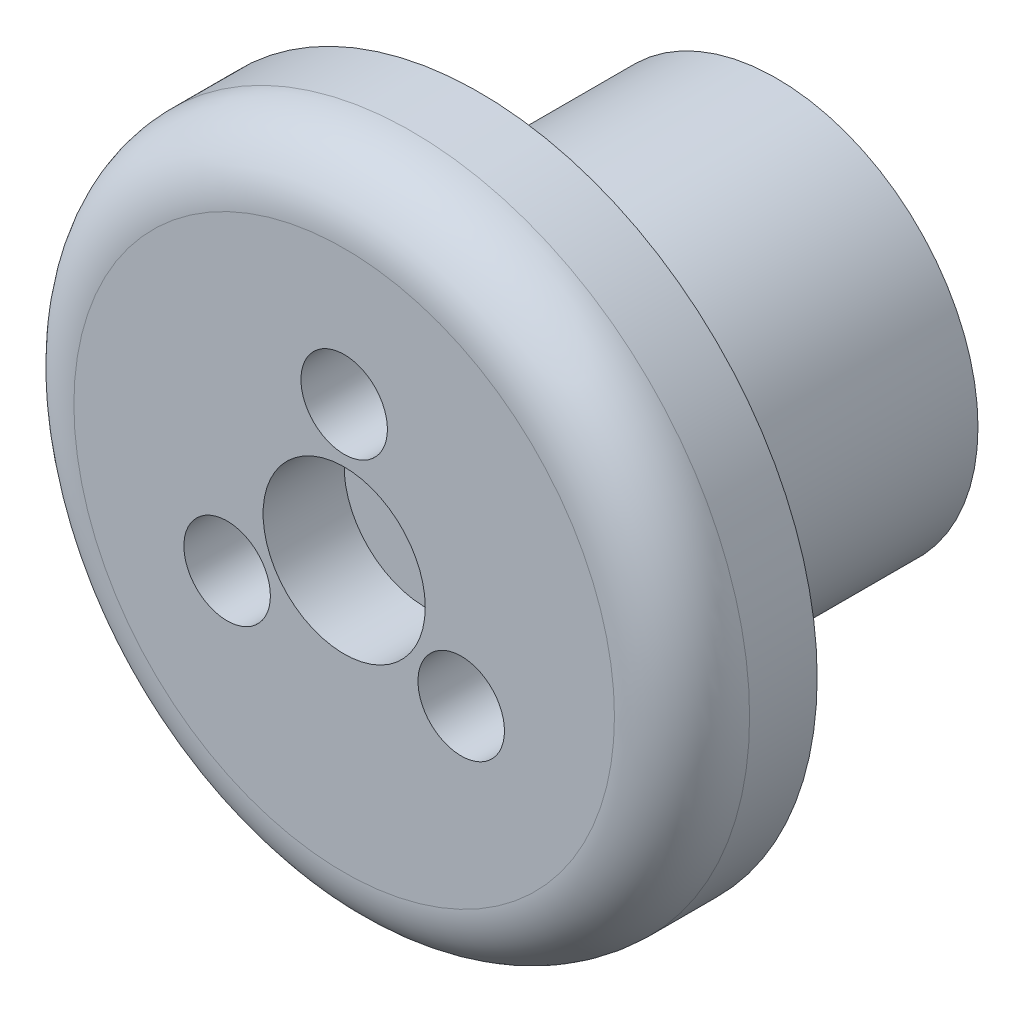
ISO-10303-21;
HEADER;
FILE_DESCRIPTION(('STEP AP214'),'2;1');
FILE_NAME('part.step','',(''),(''),'','','');
FILE_SCHEMA(('AUTOMOTIVE_DESIGN { 1 0 10303 214 1 1 1 1 }'));
ENDSEC;
DATA;
#1=APPLICATION_CONTEXT('core data for automotive mechanical design processes');
#2=APPLICATION_PROTOCOL_DEFINITION('international standard','automotive_design',2000,#1);
#3=PRODUCT_CONTEXT('',#1,'mechanical');
#4=PRODUCT('Part','Part','',(#3));
#5=PRODUCT_RELATED_PRODUCT_CATEGORY('part','',(#4));
#6=PRODUCT_DEFINITION_FORMATION('','',#4);
#7=PRODUCT_DEFINITION_CONTEXT('part definition',#1,'design');
#8=PRODUCT_DEFINITION('design','',#6,#7);
#9=PRODUCT_DEFINITION_SHAPE('','',#8);
#10=(LENGTH_UNIT() NAMED_UNIT(*) SI_UNIT(.MILLI.,.METRE.));
#11=(NAMED_UNIT(*) PLANE_ANGLE_UNIT() SI_UNIT($,.RADIAN.));
#12=(NAMED_UNIT(*) SI_UNIT($,.STERADIAN.) SOLID_ANGLE_UNIT());
#13=UNCERTAINTY_MEASURE_WITH_UNIT(LENGTH_MEASURE(1.E-05),#10,'distance_accuracy_value','');
#14=(GEOMETRIC_REPRESENTATION_CONTEXT(3) GLOBAL_UNCERTAINTY_ASSIGNED_CONTEXT((#13)) GLOBAL_UNIT_ASSIGNED_CONTEXT((#10,
#11,#12)) REPRESENTATION_CONTEXT('',''));
#15=CARTESIAN_POINT('',(0.,0.,0.));
#16=DIRECTION('',(0.,0.,1.));
#17=DIRECTION('',(1.,0.,0.));
#18=AXIS2_PLACEMENT_3D('',#15,#16,#17);
#19=CARTESIAN_POINT('',(0.,0.,11.));
#20=DIRECTION('',(0.,0.,-1.));
#21=DIRECTION('',(-1.,0.,0.));
#22=AXIS2_PLACEMENT_3D('',#19,#20,#21);
#23=CYLINDRICAL_SURFACE('',#22,7.45);
#24=CARTESIAN_POINT('',(0.,0.,11.));
#25=DIRECTION('',(0.,0.,1.));
#26=DIRECTION('',(1.,0.,0.));
#27=AXIS2_PLACEMENT_3D('',#24,#25,#26);
#28=CIRCLE('',#27,7.45);
#29=CARTESIAN_POINT('',(7.45,0.,11.));
#30=VERTEX_POINT('',#29);
#31=EDGE_CURVE('E48',#30,#30,#28,.T.);
#32=ORIENTED_EDGE('',*,*,#31,.F.);
#33=EDGE_LOOP('',(#32));
#34=FACE_BOUND('',#33,.T.);
#35=CARTESIAN_POINT('',(0.,0.,0.));
#36=DIRECTION('',(0.,0.,1.));
#37=DIRECTION('',(1.,0.,0.));
#38=AXIS2_PLACEMENT_3D('',#35,#36,#37);
#39=CIRCLE('',#38,7.45);
#40=CARTESIAN_POINT('',(7.45,0.,0.));
#41=VERTEX_POINT('',#40);
#42=EDGE_CURVE('E52',#41,#41,#39,.T.);
#43=ORIENTED_EDGE('',*,*,#42,.T.);
#44=EDGE_LOOP('',(#43));
#45=FACE_BOUND('',#44,.T.);
#46=ADVANCED_FACE('F37',(#34,#45),#23,.T.);
#47=CARTESIAN_POINT('',(0.,0.,0.));
#48=DIRECTION('',(0.,0.,1.));
#49=DIRECTION('',(1.,0.,0.));
#50=AXIS2_PLACEMENT_3D('',#47,#48,#49);
#51=PLANE('',#50);
#52=CARTESIAN_POINT('',(0.,5.,0.));
#53=DIRECTION('',(0.,0.,1.));
#54=DIRECTION('',(1.,0.,0.));
#55=AXIS2_PLACEMENT_3D('',#52,#53,#54);
#56=CIRCLE('',#55,1.6);
#57=CARTESIAN_POINT('',(1.6,5.,0.));
#58=VERTEX_POINT('',#57);
#59=EDGE_CURVE('E60',#58,#58,#56,.T.);
#60=ORIENTED_EDGE('',*,*,#59,.T.);
#61=EDGE_LOOP('',(#60));
#62=FACE_BOUND('',#61,.T.);
#63=CARTESIAN_POINT('',(4.33012701892251,-2.49999999999982,0.));
#64=DIRECTION('',(0.,0.,1.));
#65=DIRECTION('',(1.,0.,0.));
#66=AXIS2_PLACEMENT_3D('',#63,#64,#65);
#67=CIRCLE('',#66,1.60000000000027);
#68=CARTESIAN_POINT('',(5.93012701892278,-2.49999999999982,0.));
#69=VERTEX_POINT('',#68);
#70=EDGE_CURVE('E68',#69,#69,#67,.T.);
#71=ORIENTED_EDGE('',*,*,#70,.T.);
#72=EDGE_LOOP('',(#71));
#73=FACE_BOUND('',#72,.T.);
#74=CARTESIAN_POINT('',(-4.33012701892188,-2.50000000000018,0.));
#75=DIRECTION('',(0.,0.,1.));
#76=DIRECTION('',(1.,0.,0.));
#77=AXIS2_PLACEMENT_3D('',#74,#75,#76);
#78=CIRCLE('',#77,1.6000000000004);
#79=CARTESIAN_POINT('',(-2.73012701892148,-2.50000000000018,0.));
#80=VERTEX_POINT('',#79);
#81=EDGE_CURVE('E61',#80,#80,#78,.T.);
#82=ORIENTED_EDGE('',*,*,#81,.T.);
#83=EDGE_LOOP('',(#82));
#84=FACE_BOUND('',#83,.T.);
#85=ORIENTED_EDGE('',*,*,#42,.F.);
#86=EDGE_LOOP('',(#85));
#87=FACE_BOUND('',#86,.T.);
#88=ADVANCED_FACE('F122',(#62,#73,#84,#87),#51,.F.);
#89=CARTESIAN_POINT('',(0.,0.,16.));
#90=DIRECTION('',(0.,0.,-1.));
#91=DIRECTION('',(-1.,0.,0.));
#92=AXIS2_PLACEMENT_3D('',#89,#90,#91);
#93=CYLINDRICAL_SURFACE('',#92,12.5);
#94=CARTESIAN_POINT('',(0.,0.,13.5));
#95=DIRECTION('',(0.,0.,1.));
#96=DIRECTION('',(1.,0.,0.));
#97=AXIS2_PLACEMENT_3D('',#94,#95,#96);
#98=CIRCLE('',#97,12.5);
#99=CARTESIAN_POINT('',(12.5,0.,13.5));
#100=VERTEX_POINT('',#99);
#101=EDGE_CURVE('E10',#100,#100,#98,.F.);
#102=ORIENTED_EDGE('',*,*,#101,.T.);
#103=EDGE_LOOP('',(#102));
#104=FACE_BOUND('',#103,.T.);
#105=CARTESIAN_POINT('',(0.,0.,11.));
#106=DIRECTION('',(0.,0.,1.));
#107=DIRECTION('',(1.,0.,0.));
#108=AXIS2_PLACEMENT_3D('',#105,#106,#107);
#109=CIRCLE('',#108,12.5);
#110=CARTESIAN_POINT('',(12.5,0.,11.));
#111=VERTEX_POINT('',#110);
#112=EDGE_CURVE('E56',#111,#111,#109,.T.);
#113=ORIENTED_EDGE('',*,*,#112,.T.);
#114=EDGE_LOOP('',(#113));
#115=FACE_BOUND('',#114,.T.);
#116=ADVANCED_FACE('F96',(#104,#115),#93,.T.);
#117=CARTESIAN_POINT('',(0.,0.,16.));
#118=DIRECTION('',(0.,0.,1.));
#119=DIRECTION('',(1.,0.,0.));
#120=AXIS2_PLACEMENT_3D('',#117,#118,#119);
#121=PLANE('',#120);
#122=CARTESIAN_POINT('',(0.,0.,16.));
#123=DIRECTION('',(0.,0.,1.));
#124=DIRECTION('',(1.,0.,0.));
#125=AXIS2_PLACEMENT_3D('',#122,#123,#124);
#126=CIRCLE('',#125,3.);
#127=CARTESIAN_POINT('',(3.,0.,16.));
#128=VERTEX_POINT('',#127);
#129=EDGE_CURVE('E79',#128,#128,#126,.T.);
#130=ORIENTED_EDGE('',*,*,#129,.F.);
#131=EDGE_LOOP('',(#130));
#132=FACE_BOUND('',#131,.T.);
#133=CARTESIAN_POINT('',(0.,0.,16.));
#134=DIRECTION('',(0.,0.,1.));
#135=DIRECTION('',(1.,0.,0.));
#136=AXIS2_PLACEMENT_3D('',#133,#134,#135);
#137=CIRCLE('',#136,10.);
#138=CARTESIAN_POINT('',(10.,0.,16.));
#139=VERTEX_POINT('',#138);
#140=EDGE_CURVE('E44',#139,#139,#137,.T.);
#141=ORIENTED_EDGE('',*,*,#140,.T.);
#142=EDGE_LOOP('',(#141));
#143=FACE_BOUND('',#142,.T.);
#144=CARTESIAN_POINT('',(0.,5.,16.));
#145=DIRECTION('',(0.,0.,1.));
#146=DIRECTION('',(1.,0.,0.));
#147=AXIS2_PLACEMENT_3D('',#144,#145,#146);
#148=CIRCLE('',#147,1.6);
#149=CARTESIAN_POINT('',(1.6,5.,16.));
#150=VERTEX_POINT('',#149);
#151=EDGE_CURVE('E74',#150,#150,#148,.T.);
#152=ORIENTED_EDGE('',*,*,#151,.F.);
#153=EDGE_LOOP('',(#152));
#154=FACE_BOUND('',#153,.T.);
#155=CARTESIAN_POINT('',(4.33012701892251,-2.49999999999982,16.));
#156=DIRECTION('',(0.,0.,1.));
#157=DIRECTION('',(1.,0.,0.));
#158=AXIS2_PLACEMENT_3D('',#155,#156,#157);
#159=CIRCLE('',#158,1.60000000000027);
#160=CARTESIAN_POINT('',(5.93012701892278,-2.49999999999982,16.));
#161=VERTEX_POINT('',#160);
#162=EDGE_CURVE('E71',#161,#161,#159,.T.);
#163=ORIENTED_EDGE('',*,*,#162,.F.);
#164=EDGE_LOOP('',(#163));
#165=FACE_BOUND('',#164,.T.);
#166=CARTESIAN_POINT('',(-4.33012701892188,-2.50000000000018,16.));
#167=DIRECTION('',(0.,0.,1.));
#168=DIRECTION('',(1.,0.,0.));
#169=AXIS2_PLACEMENT_3D('',#166,#167,#168);
#170=CIRCLE('',#169,1.6000000000004);
#171=CARTESIAN_POINT('',(-2.73012701892148,-2.50000000000018,16.));
#172=VERTEX_POINT('',#171);
#173=EDGE_CURVE('E64',#172,#172,#170,.T.);
#174=ORIENTED_EDGE('',*,*,#173,.F.);
#175=EDGE_LOOP('',(#174));
#176=FACE_BOUND('',#175,.T.);
#177=ADVANCED_FACE('F93',(#132,#143,#154,#165,#176),#121,.T.);
#178=CARTESIAN_POINT('',(0.,0.,11.));
#179=DIRECTION('',(0.,0.,1.));
#180=DIRECTION('',(1.,0.,0.));
#181=AXIS2_PLACEMENT_3D('',#178,#179,#180);
#182=PLANE('',#181);
#183=ORIENTED_EDGE('',*,*,#31,.T.);
#184=EDGE_LOOP('',(#183));
#185=FACE_BOUND('',#184,.T.);
#186=ORIENTED_EDGE('',*,*,#112,.F.);
#187=EDGE_LOOP('',(#186));
#188=FACE_BOUND('',#187,.T.);
#189=ADVANCED_FACE('F95',(#185,#188),#182,.F.);
#190=CARTESIAN_POINT('',(-4.33012701892188,-2.50000000000018,0.));
#191=DIRECTION('',(0.,0.,1.));
#192=DIRECTION('',(1.,0.,0.));
#193=AXIS2_PLACEMENT_3D('',#190,#191,#192);
#194=CYLINDRICAL_SURFACE('',#193,1.6000000000004);
#195=ORIENTED_EDGE('',*,*,#81,.F.);
#196=EDGE_LOOP('',(#195));
#197=FACE_BOUND('',#196,.T.);
#198=ORIENTED_EDGE('',*,*,#173,.T.);
#199=EDGE_LOOP('',(#198));
#200=FACE_BOUND('',#199,.T.);
#201=ADVANCED_FACE('F105',(#197,#200),#194,.F.);
#202=CARTESIAN_POINT('',(4.33012701892251,-2.49999999999982,0.));
#203=DIRECTION('',(0.,0.,1.));
#204=DIRECTION('',(1.,0.,0.));
#205=AXIS2_PLACEMENT_3D('',#202,#203,#204);
#206=CYLINDRICAL_SURFACE('',#205,1.60000000000027);
#207=ORIENTED_EDGE('',*,*,#70,.F.);
#208=EDGE_LOOP('',(#207));
#209=FACE_BOUND('',#208,.T.);
#210=ORIENTED_EDGE('',*,*,#162,.T.);
#211=EDGE_LOOP('',(#210));
#212=FACE_BOUND('',#211,.T.);
#213=ADVANCED_FACE('F107',(#209,#212),#206,.F.);
#214=CARTESIAN_POINT('',(0.,5.,0.));
#215=DIRECTION('',(0.,0.,1.));
#216=DIRECTION('',(1.,0.,0.));
#217=AXIS2_PLACEMENT_3D('',#214,#215,#216);
#218=CYLINDRICAL_SURFACE('',#217,1.6);
#219=ORIENTED_EDGE('',*,*,#59,.F.);
#220=EDGE_LOOP('',(#219));
#221=FACE_BOUND('',#220,.T.);
#222=ORIENTED_EDGE('',*,*,#151,.T.);
#223=EDGE_LOOP('',(#222));
#224=FACE_BOUND('',#223,.T.);
#225=ADVANCED_FACE('F114',(#221,#224),#218,.F.);
#226=CARTESIAN_POINT('',(0.,0.,13.5));
#227=DIRECTION('',(0.,0.,1.));
#228=DIRECTION('',(1.,0.,0.));
#229=AXIS2_PLACEMENT_3D('',#226,#227,#228);
#230=TOROIDAL_SURFACE('',#229,10.,2.5);
#231=ORIENTED_EDGE('',*,*,#101,.F.);
#232=EDGE_LOOP('',(#231));
#233=FACE_BOUND('',#232,.T.);
#234=ORIENTED_EDGE('',*,*,#140,.F.);
#235=EDGE_LOOP('',(#234));
#236=FACE_BOUND('',#235,.T.);
#237=ADVANCED_FACE('F39',(#233,#236),#230,.T.);
#238=CARTESIAN_POINT('',(0.,0.,13.));
#239=DIRECTION('',(0.,0.,1.));
#240=DIRECTION('',(1.,0.,0.));
#241=AXIS2_PLACEMENT_3D('',#238,#239,#240);
#242=CYLINDRICAL_SURFACE('',#241,3.);
#243=CARTESIAN_POINT('',(0.,0.,13.));
#244=DIRECTION('',(0.,0.,1.));
#245=DIRECTION('',(1.,0.,0.));
#246=AXIS2_PLACEMENT_3D('',#243,#244,#245);
#247=CIRCLE('',#246,3.);
#248=CARTESIAN_POINT('',(3.,0.,13.));
#249=VERTEX_POINT('',#248);
#250=EDGE_CURVE('E65',#249,#249,#247,.T.);
#251=ORIENTED_EDGE('',*,*,#250,.F.);
#252=EDGE_LOOP('',(#251));
#253=FACE_BOUND('',#252,.T.);
#254=ORIENTED_EDGE('',*,*,#129,.T.);
#255=EDGE_LOOP('',(#254));
#256=FACE_BOUND('',#255,.T.);
#257=ADVANCED_FACE('F87',(#253,#256),#242,.F.);
#258=CARTESIAN_POINT('',(0.,0.,13.));
#259=DIRECTION('',(0.,0.,1.));
#260=DIRECTION('',(1.,0.,0.));
#261=AXIS2_PLACEMENT_3D('',#258,#259,#260);
#262=PLANE('',#261);
#263=ORIENTED_EDGE('',*,*,#250,.T.);
#264=EDGE_LOOP('',(#263));
#265=FACE_BOUND('',#264,.T.);
#266=ADVANCED_FACE('F85',(#265),#262,.T.);
#267=CLOSED_SHELL('',(#46,#88,#116,#177,#189,#201,#213,#225,#237,#257,#266));
#268=MANIFOLD_SOLID_BREP('B2',#267);
#269=ADVANCED_BREP_SHAPE_REPRESENTATION('',(#18,#268),#14);
#270=SHAPE_DEFINITION_REPRESENTATION(#9,#269);
ENDSEC;
END-ISO-10303-21;
